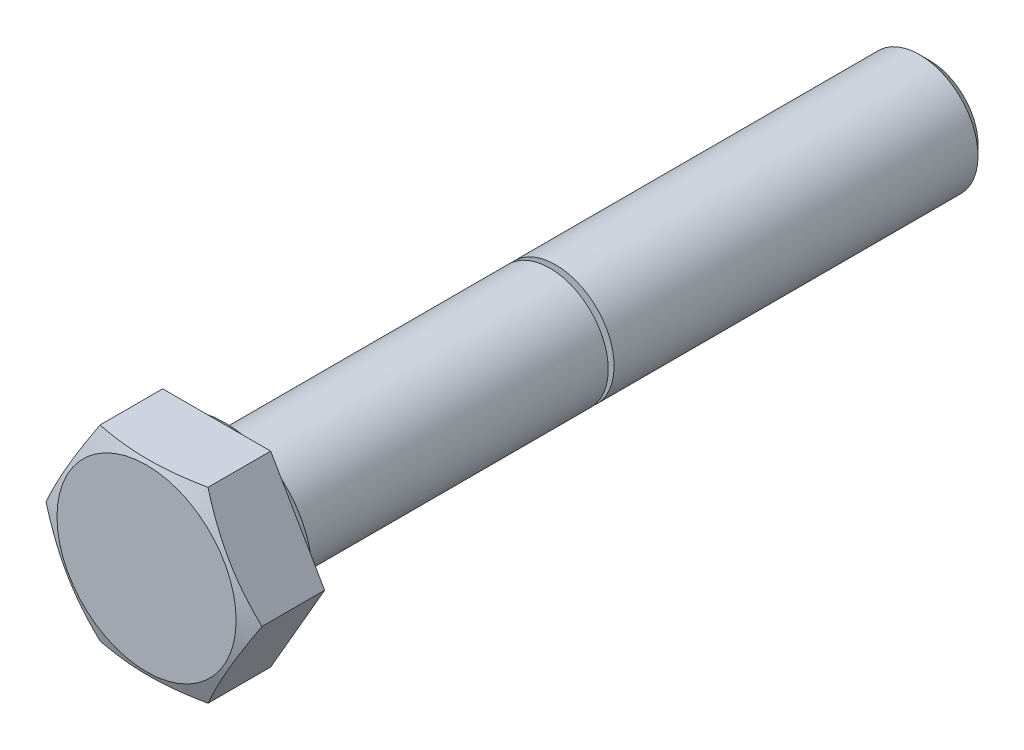
ISO-10303-21;
HEADER;
FILE_DESCRIPTION(('STEP AP214'),'2;1');
FILE_NAME('part.step','',(''),(''),'','','');
FILE_SCHEMA(('AUTOMOTIVE_DESIGN { 1 0 10303 214 1 1 1 1 }'));
ENDSEC;
DATA;
#1=APPLICATION_CONTEXT('core data for automotive mechanical design processes');
#2=APPLICATION_PROTOCOL_DEFINITION('international standard','automotive_design',2000,#1);
#3=PRODUCT_CONTEXT('',#1,'mechanical');
#4=PRODUCT('Part','Part','',(#3));
#5=PRODUCT_RELATED_PRODUCT_CATEGORY('part','',(#4));
#6=PRODUCT_DEFINITION_FORMATION('','',#4);
#7=PRODUCT_DEFINITION_CONTEXT('part definition',#1,'design');
#8=PRODUCT_DEFINITION('design','',#6,#7);
#9=PRODUCT_DEFINITION_SHAPE('','',#8);
#10=(LENGTH_UNIT() NAMED_UNIT(*) SI_UNIT(.MILLI.,.METRE.));
#11=(NAMED_UNIT(*) PLANE_ANGLE_UNIT() SI_UNIT($,.RADIAN.));
#12=(NAMED_UNIT(*) SI_UNIT($,.STERADIAN.) SOLID_ANGLE_UNIT());
#13=UNCERTAINTY_MEASURE_WITH_UNIT(LENGTH_MEASURE(1.E-05),#10,'distance_accuracy_value','');
#14=(GEOMETRIC_REPRESENTATION_CONTEXT(3) GLOBAL_UNCERTAINTY_ASSIGNED_CONTEXT((#13)) GLOBAL_UNIT_ASSIGNED_CONTEXT((#10,
#11,#12)) REPRESENTATION_CONTEXT('',''));
#15=CARTESIAN_POINT('',(0.,0.,0.));
#16=DIRECTION('',(0.,0.,1.));
#17=DIRECTION('',(1.,0.,0.));
#18=AXIS2_PLACEMENT_3D('',#15,#16,#17);
#19=CARTESIAN_POINT('',(0.,3.9999981349996,3.49999999999987));
#20=DIRECTION('',(0.,1.00000000000001,0.));
#21=DIRECTION('',(1.00000000000001,0.,0.));
#22=AXIS2_PLACEMENT_3D('',#19,#20,#21);
#23=PLANE('',#22);
#24=DIRECTION('',(-1.00000000000001,0.,0.));
#25=VECTOR('',#24,1.);
#26=CARTESIAN_POINT('',(0.,3.9999981349996,0.499999999999874));
#27=LINE('',#26,#25);
#28=CARTESIAN_POINT('',(2.3094,3.99999813499957,0.499999999999874));
#29=VERTEX_POINT('',#28);
#30=CARTESIAN_POINT('',(-2.30939999999998,3.99999813499953,0.500000000000089));
#31=VERTEX_POINT('',#30);
#32=EDGE_CURVE('E13',#29,#31,#27,.T.);
#33=ORIENTED_EDGE('',*,*,#32,.T.);
#34=DIRECTION('',(0.,0.,0.999999999999991));
#35=VECTOR('',#34,1.);
#36=CARTESIAN_POINT('',(-2.30939999999998,3.99999813499953,1.84090909090918));
#37=LINE('',#36,#35);
#38=CARTESIAN_POINT('',(-2.30939999999998,3.99999813499953,3.18181818181806));
#39=VERTEX_POINT('',#38);
#40=EDGE_CURVE('E34',#31,#39,#37,.T.);
#41=ORIENTED_EDGE('',*,*,#40,.T.);
#42=CARTESIAN_POINT('',(-2.30939999999998,3.99999813499953,3.18181818181805));
#43=CARTESIAN_POINT('',(1.59245347466139E-13,3.9999981349997,3.64834726478994));
#44=CARTESIAN_POINT('',(2.30940000000001,3.99999813499957,3.18181818181805));
#45=(BOUNDED_CURVE() B_SPLINE_CURVE(2,(#42,#43,#44),.UNSPECIFIED.,.F.,
.F.) B_SPLINE_CURVE_WITH_KNOTS((3,3),(0.,4.6457871028175),
.UNSPECIFIED.) CURVE() GEOMETRIC_REPRESENTATION_ITEM() RATIONAL_B_SPLINE_CURVE((1.,
1.15470053837925,1.)) REPRESENTATION_ITEM(''));
#46=CARTESIAN_POINT('',(2.30940000000001,3.99999813499957,3.18181818181806));
#47=VERTEX_POINT('',#46);
#48=EDGE_CURVE('E123',#39,#47,#45,.T.);
#49=ORIENTED_EDGE('',*,*,#48,.T.);
#50=DIRECTION('',(0.,0.,0.999999999999991));
#51=VECTOR('',#50,1.);
#52=CARTESIAN_POINT('',(2.3094,3.99999813499957,1.84090909090896));
#53=LINE('',#52,#51);
#54=EDGE_CURVE('E154',#29,#47,#53,.T.);
#55=ORIENTED_EDGE('',*,*,#54,.F.);
#56=EDGE_LOOP('',(#33,#41,#49,#55));
#57=FACE_BOUND('',#56,.T.);
#58=ADVANCED_FACE('F24',(#57),#23,.T.);
#59=CARTESIAN_POINT('',(-3.46410000000002,1.99999906749982,3.49999999999986));
#60=DIRECTION('',(-0.866025403784446,0.500000000000003,0.));
#61=DIRECTION('',(0.500000000000005,0.866025403784447,0.));
#62=AXIS2_PLACEMENT_3D('',#59,#60,#61);
#63=PLANE('',#62);
#64=DIRECTION('',(-0.500000000000005,-0.866025403784447,0.));
#65=VECTOR('',#64,1.);
#66=CARTESIAN_POINT('',(-2.54516044404436,3.59164906749983,0.499999999999978));
#67=LINE('',#66,#65);
#68=CARTESIAN_POINT('',(-4.61880000000001,0.,0.499999999999988));
#69=VERTEX_POINT('',#68);
#70=EDGE_CURVE('E119',#31,#69,#67,.T.);
#71=ORIENTED_EDGE('',*,*,#70,.T.);
#72=DIRECTION('',(0.,0.,-0.999999999999991));
#73=VECTOR('',#72,1.);
#74=CARTESIAN_POINT('',(-4.61880000000001,0.,1.84090909090906));
#75=LINE('',#74,#73);
#76=CARTESIAN_POINT('',(-4.6188,0.,3.18181818181816));
#77=VERTEX_POINT('',#76);
#78=EDGE_CURVE('E107',#77,#69,#75,.T.);
#79=ORIENTED_EDGE('',*,*,#78,.F.);
#80=CARTESIAN_POINT('',(-4.6188,0.,3.18181818181816));
#81=CARTESIAN_POINT('',(-3.46409999999992,1.99999906749988,3.64834726478993));
#82=CARTESIAN_POINT('',(-2.30939999999998,3.99999813499953,3.18181818181805));
#83=(BOUNDED_CURVE() B_SPLINE_CURVE(2,(#80,#81,#82),.UNSPECIFIED.,.F.,
.F.) B_SPLINE_CURVE_WITH_KNOTS((3,3),(0.,4.6457871028175),
.UNSPECIFIED.) CURVE() GEOMETRIC_REPRESENTATION_ITEM() RATIONAL_B_SPLINE_CURVE((1.,
1.15470053837925,1.)) REPRESENTATION_ITEM(''));
#84=EDGE_CURVE('E124',#77,#39,#83,.T.);
#85=ORIENTED_EDGE('',*,*,#84,.T.);
#86=ORIENTED_EDGE('',*,*,#40,.F.);
#87=EDGE_LOOP('',(#71,#79,#85,#86));
#88=FACE_BOUND('',#87,.T.);
#89=ADVANCED_FACE('F120',(#88),#63,.T.);
#90=CARTESIAN_POINT('',(-3.46410000000003,-1.99999906749977,3.49999999999986));
#91=DIRECTION('',(-0.866025403784448,-0.500000000000006,0.));
#92=DIRECTION('',(-0.500000000000006,0.866025403784447,0.));
#93=AXIS2_PLACEMENT_3D('',#90,#91,#92);
#94=PLANE('',#93);
#95=DIRECTION('',(0.500000000000006,-0.866025403784447,0.));
#96=VECTOR('',#95,1.);
#97=CARTESIAN_POINT('',(-4.38303955595568,-0.408349067499789,0.499999999999988));
#98=LINE('',#97,#96);
#99=CARTESIAN_POINT('',(-2.30940000000003,-3.9999981349996,0.499999999999978));
#100=VERTEX_POINT('',#99);
#101=EDGE_CURVE('E111',#69,#100,#98,.T.);
#102=ORIENTED_EDGE('',*,*,#101,.T.);
#103=DIRECTION('',(0.,0.,0.999999999999991));
#104=VECTOR('',#103,1.);
#105=CARTESIAN_POINT('',(-2.30940000000003,-3.9999981349996,1.84090909090906));
#106=LINE('',#105,#104);
#107=CARTESIAN_POINT('',(-2.3094,-3.99999813499962,3.18181818181805));
#108=VERTEX_POINT('',#107);
#109=EDGE_CURVE('E129',#100,#108,#106,.T.);
#110=ORIENTED_EDGE('',*,*,#109,.T.);
#111=CARTESIAN_POINT('',(-2.30940000000003,-3.9999981349996,3.18181818181805));
#112=CARTESIAN_POINT('',(-3.46409999999999,-1.99999906749976,3.64834726478994));
#113=CARTESIAN_POINT('',(-4.6188,0.,3.18181818181816));
#114=(BOUNDED_CURVE() B_SPLINE_CURVE(2,(#111,#112,#113),.UNSPECIFIED.,.F.,
.F.) B_SPLINE_CURVE_WITH_KNOTS((3,3),(0.,4.6457871028175),
.UNSPECIFIED.) CURVE() GEOMETRIC_REPRESENTATION_ITEM() RATIONAL_B_SPLINE_CURVE((1.,
1.15470053837925,1.)) REPRESENTATION_ITEM(''));
#115=EDGE_CURVE('E114',#108,#77,#114,.T.);
#116=ORIENTED_EDGE('',*,*,#115,.T.);
#117=ORIENTED_EDGE('',*,*,#78,.T.);
#118=EDGE_LOOP('',(#102,#110,#116,#117));
#119=FACE_BOUND('',#118,.T.);
#120=ADVANCED_FACE('F108',(#119),#94,.T.);
#121=CARTESIAN_POINT('',(0.,-3.99999813499958,3.49999999999986));
#122=DIRECTION('',(0.,-1.00000000000001,0.));
#123=DIRECTION('',(-1.00000000000001,0.,0.));
#124=AXIS2_PLACEMENT_3D('',#121,#122,#123);
#125=PLANE('',#124);
#126=DIRECTION('',(1.00000000000001,0.,0.));
#127=VECTOR('',#126,1.);
#128=CARTESIAN_POINT('',(0.,-3.99999813499958,0.49999999999987));
#129=LINE('',#128,#127);
#130=CARTESIAN_POINT('',(2.30940000000003,-3.99999813499963,0.499999999999763));
#131=VERTEX_POINT('',#130);
#132=EDGE_CURVE('E116',#100,#131,#129,.T.);
#133=ORIENTED_EDGE('',*,*,#132,.T.);
#134=DIRECTION('',(0.,0.,0.999999999999991));
#135=VECTOR('',#134,1.);
#136=CARTESIAN_POINT('',(2.30940000000003,-3.99999813499963,1.84090909090885));
#137=LINE('',#136,#135);
#138=CARTESIAN_POINT('',(2.30940000000003,-3.99999813499963,3.18181818181805));
#139=VERTEX_POINT('',#138);
#140=EDGE_CURVE('E139',#131,#139,#137,.T.);
#141=ORIENTED_EDGE('',*,*,#140,.T.);
#142=CARTESIAN_POINT('',(2.30940000000003,-3.99999813499963,3.18181818181805));
#143=CARTESIAN_POINT('',(0.,-3.99999813499955,3.64834726478994));
#144=CARTESIAN_POINT('',(-2.3094,-3.99999813499962,3.18181818181805));
#145=(BOUNDED_CURVE() B_SPLINE_CURVE(2,(#142,#143,#144),.UNSPECIFIED.,.F.,
.F.) B_SPLINE_CURVE_WITH_KNOTS((3,3),(0.,4.6457871028175),
.UNSPECIFIED.) CURVE() GEOMETRIC_REPRESENTATION_ITEM() RATIONAL_B_SPLINE_CURVE((1.,
1.15470053837925,1.)) REPRESENTATION_ITEM(''));
#146=EDGE_CURVE('E142',#139,#108,#145,.T.);
#147=ORIENTED_EDGE('',*,*,#146,.T.);
#148=ORIENTED_EDGE('',*,*,#109,.F.);
#149=EDGE_LOOP('',(#133,#141,#147,#148));
#150=FACE_BOUND('',#149,.T.);
#151=ADVANCED_FACE('F252',(#150),#125,.T.);
#152=CARTESIAN_POINT('',(3.4641,-1.99999906749978,3.49999999999987));
#153=DIRECTION('',(0.866025403784446,-0.500000000000003,0.));
#154=DIRECTION('',(-0.500000000000005,-0.866025403784447,0.));
#155=AXIS2_PLACEMENT_3D('',#152,#153,#154);
#156=PLANE('',#155);
#157=DIRECTION('',(0.500000000000005,0.866025403784447,0.));
#158=VECTOR('',#157,1.);
#159=CARTESIAN_POINT('',(4.38303955595568,-0.408349067499779,0.499999999999874));
#160=LINE('',#159,#158);
#161=CARTESIAN_POINT('',(4.61880000000001,0.,0.499999999999874));
#162=VERTEX_POINT('',#161);
#163=EDGE_CURVE('E147',#131,#162,#160,.T.);
#164=ORIENTED_EDGE('',*,*,#163,.T.);
#165=DIRECTION('',(0.,0.,0.999999999999991));
#166=VECTOR('',#165,1.);
#167=CARTESIAN_POINT('',(4.61880000000001,0.,1.84090909090896));
#168=LINE('',#167,#166);
#169=CARTESIAN_POINT('',(4.61880000000001,0.,3.18181818181805));
#170=VERTEX_POINT('',#169);
#171=EDGE_CURVE('E169',#162,#170,#168,.T.);
#172=ORIENTED_EDGE('',*,*,#171,.T.);
#173=CARTESIAN_POINT('',(4.6188,0.,3.18181818181805));
#174=CARTESIAN_POINT('',(3.46410000000014,-1.99999906749972,3.64834726478993));
#175=CARTESIAN_POINT('',(2.30940000000003,-3.99999813499963,3.18181818181805));
#176=(BOUNDED_CURVE() B_SPLINE_CURVE(2,(#173,#174,#175),.UNSPECIFIED.,.F.,
.F.) B_SPLINE_CURVE_WITH_KNOTS((3,3),(0.,4.6457871028175),
.UNSPECIFIED.) CURVE() GEOMETRIC_REPRESENTATION_ITEM() RATIONAL_B_SPLINE_CURVE((1.,
1.15470053837925,1.)) REPRESENTATION_ITEM(''));
#177=EDGE_CURVE('E135',#170,#139,#176,.T.);
#178=ORIENTED_EDGE('',*,*,#177,.T.);
#179=ORIENTED_EDGE('',*,*,#140,.F.);
#180=EDGE_LOOP('',(#164,#172,#178,#179));
#181=FACE_BOUND('',#180,.T.);
#182=ADVANCED_FACE('F242',(#181),#156,.T.);
#183=CARTESIAN_POINT('',(3.46410000000004,1.99999906749981,3.49999999999987));
#184=DIRECTION('',(0.866025403784448,0.500000000000006,0.));
#185=DIRECTION('',(0.500000000000006,-0.866025403784447,0.));
#186=AXIS2_PLACEMENT_3D('',#183,#184,#185);
#187=PLANE('',#186);
#188=DIRECTION('',(-0.500000000000006,0.866025403784447,0.));
#189=VECTOR('',#188,1.);
#190=CARTESIAN_POINT('',(2.54516044404432,3.59164906749981,0.499999999999874));
#191=LINE('',#190,#189);
#192=EDGE_CURVE('E148',#162,#29,#191,.T.);
#193=ORIENTED_EDGE('',*,*,#192,.T.);
#194=ORIENTED_EDGE('',*,*,#54,.T.);
#195=CARTESIAN_POINT('',(2.3094,3.99999813499957,3.18181818181805));
#196=CARTESIAN_POINT('',(3.46410000000015,1.99999906749987,3.64834726478993));
#197=CARTESIAN_POINT('',(4.61880000000001,0.,3.18181818181805));
#198=(BOUNDED_CURVE() B_SPLINE_CURVE(2,(#195,#196,#197),.UNSPECIFIED.,.F.,
.F.) B_SPLINE_CURVE_WITH_KNOTS((3,3),(0.,4.6457871028175),
.UNSPECIFIED.) CURVE() GEOMETRIC_REPRESENTATION_ITEM() RATIONAL_B_SPLINE_CURVE((1.,
1.15470053837925,1.)) REPRESENTATION_ITEM(''));
#199=EDGE_CURVE('E158',#47,#170,#198,.T.);
#200=ORIENTED_EDGE('',*,*,#199,.T.);
#201=ORIENTED_EDGE('',*,*,#171,.F.);
#202=EDGE_LOOP('',(#193,#194,#200,#201));
#203=FACE_BOUND('',#202,.T.);
#204=ADVANCED_FACE('F239',(#203),#187,.T.);
#205=CARTESIAN_POINT('',(0.,1.91563618241105,3.49999999999987));
#206=DIRECTION('',(0.,0.,0.999999999999991));
#207=DIRECTION('',(0.,-1.00000000000001,0.));
#208=AXIS2_PLACEMENT_3D('',#205,#206,#207);
#209=PLANE('',#208);
#210=CARTESIAN_POINT('',(0.,0.,3.49999999999987));
#211=DIRECTION('',(0.,0.,-0.999999999999991));
#212=DIRECTION('',(0.,1.00000000000001,0.));
#213=AXIS2_PLACEMENT_3D('',#210,#211,#212);
#214=CIRCLE('',#213,3.83127236482209);
#215=CARTESIAN_POINT('',(0.,3.83127236482215,3.49999999999987));
#216=VERTEX_POINT('',#215);
#217=EDGE_CURVE('E155',#216,#216,#214,.T.);
#218=ORIENTED_EDGE('',*,*,#217,.F.);
#219=EDGE_LOOP('',(#218));
#220=FACE_BOUND('',#219,.T.);
#221=ADVANCED_FACE('F227',(#220),#209,.T.);
#222=CARTESIAN_POINT('',(0.,0.,3.34090909090896));
#223=DIRECTION('',(0.,0.,-0.999999999999991));
#224=DIRECTION('',(0.,1.00000000000001,0.));
#225=AXIS2_PLACEMENT_3D('',#222,#223,#224);
#226=CONICAL_SURFACE('',#225,4.22503618241105,1.18682389135614);
#227=ORIENTED_EDGE('',*,*,#146,.F.);
#228=ORIENTED_EDGE('',*,*,#177,.F.);
#229=ORIENTED_EDGE('',*,*,#199,.F.);
#230=ORIENTED_EDGE('',*,*,#48,.F.);
#231=ORIENTED_EDGE('',*,*,#84,.F.);
#232=ORIENTED_EDGE('',*,*,#115,.F.);
#233=EDGE_LOOP('',(#227,#228,#229,#230,#231,#232));
#234=FACE_BOUND('',#233,.T.);
#235=ORIENTED_EDGE('',*,*,#217,.T.);
#236=EDGE_LOOP('',(#235));
#237=FACE_BOUND('',#236,.T.);
#238=ADVANCED_FACE('F222',(#234,#237),#226,.T.);
#239=CARTESIAN_POINT('',(0.,4.24440000000004,0.499999999999874));
#240=DIRECTION('',(0.,0.,-0.999999999999991));
#241=DIRECTION('',(0.,1.00000000000001,0.));
#242=AXIS2_PLACEMENT_3D('',#239,#240,#241);
#243=PLANE('',#242);
#244=ORIENTED_EDGE('',*,*,#101,.F.);
#245=ORIENTED_EDGE('',*,*,#70,.F.);
#246=ORIENTED_EDGE('',*,*,#32,.F.);
#247=ORIENTED_EDGE('',*,*,#192,.F.);
#248=ORIENTED_EDGE('',*,*,#163,.F.);
#249=ORIENTED_EDGE('',*,*,#132,.F.);
#250=EDGE_LOOP('',(#244,#245,#246,#247,#248,#249));
#251=FACE_BOUND('',#250,.T.);
#252=CARTESIAN_POINT('',(0.,0.,0.49999999999987));
#253=DIRECTION('',(0.,0.,-0.999999999999991));
#254=DIRECTION('',(0.,1.00000000000001,0.));
#255=AXIS2_PLACEMENT_3D('',#252,#253,#254);
#256=CIRCLE('',#255,3.87);
#257=CARTESIAN_POINT('',(0.,3.87000000000008,0.499999999999874));
#258=VERTEX_POINT('',#257);
#259=EDGE_CURVE('E159',#258,#258,#256,.T.);
#260=ORIENTED_EDGE('',*,*,#259,.F.);
#261=EDGE_LOOP('',(#260));
#262=FACE_BOUND('',#261,.T.);
#263=ADVANCED_FACE('F26',(#251,#262),#243,.T.);
#264=CARTESIAN_POINT('',(0.,0.,0.49999999999987));
#265=DIRECTION('',(0.,0.,-0.999999999999991));
#266=DIRECTION('',(-1.00000000000001,0.,0.));
#267=AXIS2_PLACEMENT_3D('',#264,#265,#266);
#268=TOROIDAL_SURFACE('',#267,3.37,0.5);
#269=CARTESIAN_POINT('',(0.,0.,0.));
#270=DIRECTION('',(0.,0.,-0.999999999999991));
#271=DIRECTION('',(0.,1.00000000000001,0.));
#272=AXIS2_PLACEMENT_3D('',#269,#270,#271);
#273=CIRCLE('',#272,3.37);
#274=CARTESIAN_POINT('',(0.,3.36999999999997,0.));
#275=VERTEX_POINT('',#274);
#276=EDGE_CURVE('E187',#275,#275,#273,.T.);
#277=ORIENTED_EDGE('',*,*,#276,.F.);
#278=EDGE_LOOP('',(#277));
#279=FACE_BOUND('',#278,.T.);
#280=ORIENTED_EDGE('',*,*,#259,.T.);
#281=EDGE_LOOP('',(#280));
#282=FACE_BOUND('',#281,.T.);
#283=ADVANCED_FACE('F217',(#279,#282),#268,.T.);
#284=CARTESIAN_POINT('',(0.,3.06000000000004,0.));
#285=DIRECTION('',(0.,0.,-0.999999999999991));
#286=DIRECTION('',(0.,1.00000000000001,0.));
#287=AXIS2_PLACEMENT_3D('',#284,#285,#286);
#288=PLANE('',#287);
#289=CARTESIAN_POINT('',(0.,0.,0.));
#290=DIRECTION('',(0.,0.,-0.999999999999991));
#291=DIRECTION('',(0.,1.00000000000001,0.));
#292=AXIS2_PLACEMENT_3D('',#289,#290,#291);
#293=CIRCLE('',#292,2.75);
#294=CARTESIAN_POINT('',(0.,2.75000000000001,0.));
#295=VERTEX_POINT('',#294);
#296=EDGE_CURVE('E194',#295,#295,#293,.T.);
#297=ORIENTED_EDGE('',*,*,#296,.F.);
#298=EDGE_LOOP('',(#297));
#299=FACE_BOUND('',#298,.T.);
#300=ORIENTED_EDGE('',*,*,#276,.T.);
#301=EDGE_LOOP('',(#300));
#302=FACE_BOUND('',#301,.T.);
#303=ADVANCED_FACE('F215',(#299,#302),#288,.T.);
#304=CARTESIAN_POINT('',(0.,0.,-0.25));
#305=DIRECTION('',(0.,0.,-0.999999999999991));
#306=DIRECTION('',(-1.00000000000001,0.,0.));
#307=AXIS2_PLACEMENT_3D('',#304,#305,#306);
#308=TOROIDAL_SURFACE('',#307,2.75,0.25);
#309=CARTESIAN_POINT('',(0.,0.,-0.25));
#310=DIRECTION('',(0.,0.,-0.999999999999991));
#311=DIRECTION('',(0.,1.00000000000001,0.));
#312=AXIS2_PLACEMENT_3D('',#309,#310,#311);
#313=CIRCLE('',#312,2.5);
#314=CARTESIAN_POINT('',(0.,2.5,-0.25));
#315=VERTEX_POINT('',#314);
#316=EDGE_CURVE('E91',#315,#315,#313,.T.);
#317=ORIENTED_EDGE('',*,*,#316,.F.);
#318=EDGE_LOOP('',(#317));
#319=FACE_BOUND('',#318,.T.);
#320=ORIENTED_EDGE('',*,*,#296,.T.);
#321=EDGE_LOOP('',(#320));
#322=FACE_BOUND('',#321,.T.);
#323=ADVANCED_FACE('F280',(#319,#322),#308,.F.);
#324=CARTESIAN_POINT('',(0.,0.,-7.00000366672038));
#325=DIRECTION('',(0.,0.,0.999999999999991));
#326=DIRECTION('',(0.,1.00000000000001,0.));
#327=AXIS2_PLACEMENT_3D('',#324,#325,#326);
#328=CYLINDRICAL_SURFACE('',#327,2.5);
#329=CARTESIAN_POINT('',(0.,0.,-13.7500073334408));
#330=DIRECTION('',(0.,0.,-0.999999999999991));
#331=DIRECTION('',(0.,1.00000000000001,0.));
#332=AXIS2_PLACEMENT_3D('',#329,#330,#331);
#333=CIRCLE('',#332,2.5);
#334=CARTESIAN_POINT('',(0.,2.50000000000001,-13.7500073334408));
#335=VERTEX_POINT('',#334);
#336=EDGE_CURVE('E28',#335,#335,#333,.T.);
#337=ORIENTED_EDGE('',*,*,#336,.F.);
#338=EDGE_LOOP('',(#337));
#339=FACE_BOUND('',#338,.T.);
#340=ORIENTED_EDGE('',*,*,#316,.T.);
#341=EDGE_LOOP('',(#340));
#342=FACE_BOUND('',#341,.T.);
#343=ADVANCED_FACE('F262',(#339,#342),#328,.T.);
#344=CARTESIAN_POINT('',(0.,0.,-13.8750036667203));
#345=DIRECTION('',(0.,0.,0.999999999999991));
#346=DIRECTION('',(0.,1.00000000000001,0.));
#347=AXIS2_PLACEMENT_3D('',#344,#345,#346);
#348=CONICAL_SURFACE('',#347,2.2835,1.0471975511966);
#349=CARTESIAN_POINT('',(0.,0.,-13.9999999999999));
#350=DIRECTION('',(0.,0.,-0.999999999999991));
#351=DIRECTION('',(0.,1.00000000000001,0.));
#352=AXIS2_PLACEMENT_3D('',#349,#350,#351);
#353=CIRCLE('',#352,2.067);
#354=CARTESIAN_POINT('',(0.,2.06700000000005,-13.9999999999999));
#355=VERTEX_POINT('',#354);
#356=EDGE_CURVE('E180',#355,#355,#353,.T.);
#357=ORIENTED_EDGE('',*,*,#356,.F.);
#358=EDGE_LOOP('',(#357));
#359=FACE_BOUND('',#358,.T.);
#360=ORIENTED_EDGE('',*,*,#336,.T.);
#361=EDGE_LOOP('',(#360));
#362=FACE_BOUND('',#361,.T.);
#363=ADVANCED_FACE('F259',(#359,#362),#348,.T.);
#364=CARTESIAN_POINT('',(0.,2.2835,-13.9999999999999));
#365=DIRECTION('',(0.,0.,0.999999999999991));
#366=DIRECTION('',(0.,-1.00000000000001,0.));
#367=AXIS2_PLACEMENT_3D('',#364,#365,#366);
#368=PLANE('',#367);
#369=CARTESIAN_POINT('',(0.,0.,-13.9999999999999));
#370=DIRECTION('',(0.,0.,-0.999999999999991));
#371=DIRECTION('',(0.,1.00000000000001,0.));
#372=AXIS2_PLACEMENT_3D('',#369,#370,#371);
#373=CIRCLE('',#372,2.5);
#374=CARTESIAN_POINT('',(0.,2.50000000000001,-13.9999999999999));
#375=VERTEX_POINT('',#374);
#376=EDGE_CURVE('E174',#375,#375,#373,.T.);
#377=ORIENTED_EDGE('',*,*,#376,.F.);
#378=EDGE_LOOP('',(#377));
#379=FACE_BOUND('',#378,.T.);
#380=ORIENTED_EDGE('',*,*,#356,.T.);
#381=EDGE_LOOP('',(#380));
#382=FACE_BOUND('',#381,.T.);
#383=ADVANCED_FACE('F261',(#379,#382),#368,.T.);
#384=CARTESIAN_POINT('',(0.,0.,-21.7834999999997));
#385=DIRECTION('',(0.,0.,0.999999999999991));
#386=DIRECTION('',(0.,1.00000000000001,0.));
#387=AXIS2_PLACEMENT_3D('',#384,#385,#386);
#388=CYLINDRICAL_SURFACE('',#387,2.5);
#389=CARTESIAN_POINT('',(-1.17961196366423E-13,0.,-29.5669999999997));
#390=DIRECTION('',(0.,0.,-0.999999999999991));
#391=DIRECTION('',(0.,1.00000000000001,0.));
#392=AXIS2_PLACEMENT_3D('',#389,#390,#391);
#393=CIRCLE('',#392,2.5);
#394=CARTESIAN_POINT('',(0.,2.50000000000001,-29.5669999999997));
#395=VERTEX_POINT('',#394);
#396=EDGE_CURVE('E181',#395,#395,#393,.T.);
#397=ORIENTED_EDGE('',*,*,#396,.F.);
#398=EDGE_LOOP('',(#397));
#399=FACE_BOUND('',#398,.T.);
#400=ORIENTED_EDGE('',*,*,#376,.T.);
#401=EDGE_LOOP('',(#400));
#402=FACE_BOUND('',#401,.T.);
#403=ADVANCED_FACE('F265',(#399,#402),#388,.T.);
#404=CARTESIAN_POINT('',(-1.17961196366423E-13,0.,-29.7834999999997));
#405=DIRECTION('',(0.,0.,0.999999999999991));
#406=DIRECTION('',(0.,1.00000000000001,0.));
#407=AXIS2_PLACEMENT_3D('',#404,#405,#406);
#408=CONICAL_SURFACE('',#407,2.2835,0.785398163397448);
#409=CARTESIAN_POINT('',(-1.17961196366423E-13,0.,-29.9999999999997));
#410=DIRECTION('',(0.,0.,-0.999999999999991));
#411=DIRECTION('',(0.,1.00000000000001,0.));
#412=AXIS2_PLACEMENT_3D('',#409,#410,#411);
#413=CIRCLE('',#412,2.067);
#414=CARTESIAN_POINT('',(0.,2.06700000000007,-29.9999999999997));
#415=VERTEX_POINT('',#414);
#416=EDGE_CURVE('E211',#415,#415,#413,.T.);
#417=ORIENTED_EDGE('',*,*,#416,.F.);
#418=EDGE_LOOP('',(#417));
#419=FACE_BOUND('',#418,.T.);
#420=ORIENTED_EDGE('',*,*,#396,.T.);
#421=EDGE_LOOP('',(#420));
#422=FACE_BOUND('',#421,.T.);
#423=ADVANCED_FACE('F247',(#419,#422),#408,.T.);
#424=CARTESIAN_POINT('',(0.,1.0335,-29.9999999999997));
#425=DIRECTION('',(0.,0.,-0.999999999999991));
#426=DIRECTION('',(0.,1.00000000000001,0.));
#427=AXIS2_PLACEMENT_3D('',#424,#425,#426);
#428=PLANE('',#427);
#429=ORIENTED_EDGE('',*,*,#416,.T.);
#430=EDGE_LOOP('',(#429));
#431=FACE_BOUND('',#430,.T.);
#432=ADVANCED_FACE('F244',(#431),#428,.T.);
#433=CLOSED_SHELL('',(#58,#89,#120,#151,#182,#204,#221,#238,#263,#283,#303,#323,#343,#363,#383,
#403,#423,#432));
#434=MANIFOLD_SOLID_BREP('B1',#433);
#435=ADVANCED_BREP_SHAPE_REPRESENTATION('',(#18,#434),#14);
#436=SHAPE_DEFINITION_REPRESENTATION(#9,#435);
ENDSEC;
END-ISO-10303-21;
